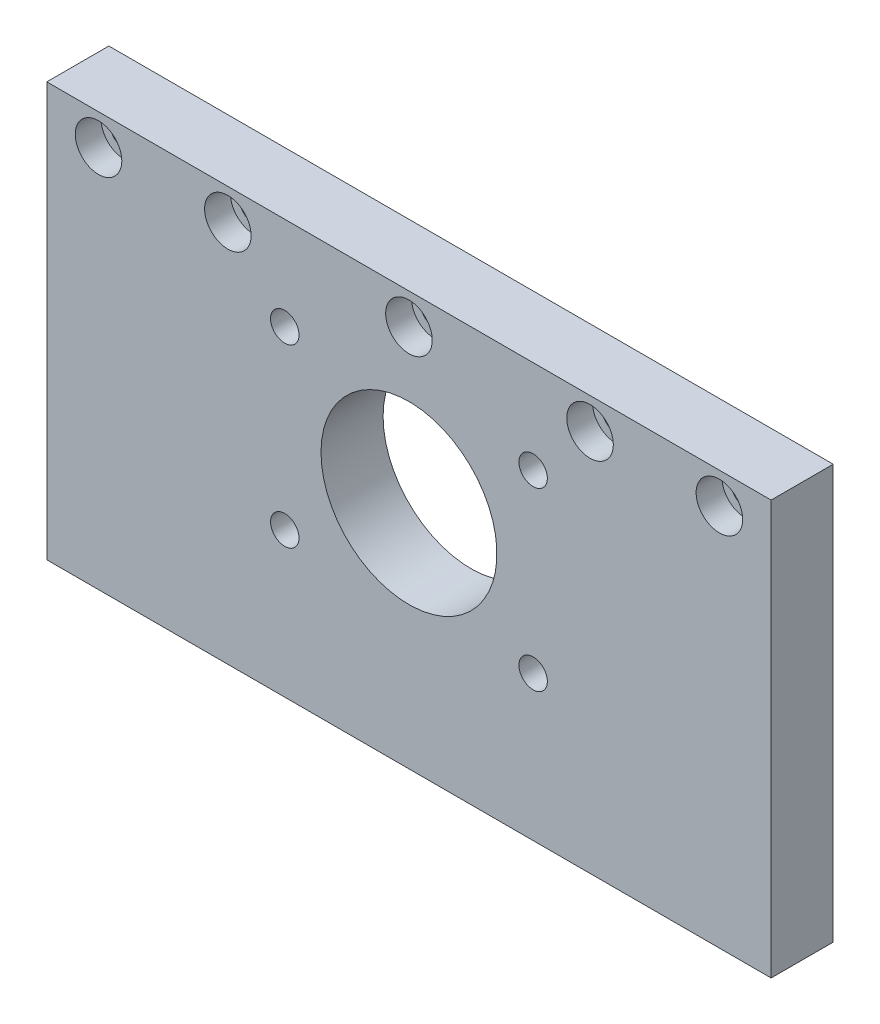
ISO-10303-21;
HEADER;
FILE_DESCRIPTION(('STEP AP214'),'2;1');
FILE_NAME('part.step','',(''),(''),'','','');
FILE_SCHEMA(('AUTOMOTIVE_DESIGN { 1 0 10303 214 1 1 1 1 }'));
ENDSEC;
DATA;
#1=APPLICATION_CONTEXT('core data for automotive mechanical design processes');
#2=APPLICATION_PROTOCOL_DEFINITION('international standard','automotive_design',2000,#1);
#3=PRODUCT_CONTEXT('',#1,'mechanical');
#4=PRODUCT('Part','Part','',(#3));
#5=PRODUCT_RELATED_PRODUCT_CATEGORY('part','',(#4));
#6=PRODUCT_DEFINITION_FORMATION('','',#4);
#7=PRODUCT_DEFINITION_CONTEXT('part definition',#1,'design');
#8=PRODUCT_DEFINITION('design','',#6,#7);
#9=PRODUCT_DEFINITION_SHAPE('','',#8);
#10=(LENGTH_UNIT() NAMED_UNIT(*) SI_UNIT(.MILLI.,.METRE.));
#11=(NAMED_UNIT(*) PLANE_ANGLE_UNIT() SI_UNIT($,.RADIAN.));
#12=(NAMED_UNIT(*) SI_UNIT($,.STERADIAN.) SOLID_ANGLE_UNIT());
#13=UNCERTAINTY_MEASURE_WITH_UNIT(LENGTH_MEASURE(1.E-05),#10,'distance_accuracy_value','');
#14=(GEOMETRIC_REPRESENTATION_CONTEXT(3) GLOBAL_UNCERTAINTY_ASSIGNED_CONTEXT((#13)) GLOBAL_UNIT_ASSIGNED_CONTEXT((#10,
#11,#12)) REPRESENTATION_CONTEXT('',''));
#15=CARTESIAN_POINT('',(0.,0.,0.));
#16=DIRECTION('',(0.,0.,1.));
#17=DIRECTION('',(1.,0.,0.));
#18=AXIS2_PLACEMENT_3D('',#15,#16,#17);
#19=CARTESIAN_POINT('',(0.,13.,12.));
#20=DIRECTION('',(-1.,0.,0.));
#21=DIRECTION('',(0.,-1.,0.));
#22=AXIS2_PLACEMENT_3D('',#19,#20,#21);
#23=PLANE('',#22);
#24=DIRECTION('',(0.,1.,0.));
#25=VECTOR('',#24,1.);
#26=CARTESIAN_POINT('',(0.,13.,0.));
#27=LINE('',#26,#25);
#28=CARTESIAN_POINT('',(0.,-67.,0.));
#29=VERTEX_POINT('',#28);
#30=CARTESIAN_POINT('',(0.,13.,0.));
#31=VERTEX_POINT('',#30);
#32=EDGE_CURVE('E95',#29,#31,#27,.T.);
#33=ORIENTED_EDGE('',*,*,#32,.T.);
#34=DIRECTION('',(0.,0.,-1.));
#35=VECTOR('',#34,1.);
#36=CARTESIAN_POINT('',(0.,13.,12.));
#37=LINE('',#36,#35);
#38=CARTESIAN_POINT('',(0.,13.,12.));
#39=VERTEX_POINT('',#38);
#40=EDGE_CURVE('E11',#39,#31,#37,.T.);
#41=ORIENTED_EDGE('',*,*,#40,.F.);
#42=DIRECTION('',(0.,1.,0.));
#43=VECTOR('',#42,1.);
#44=CARTESIAN_POINT('',(0.,13.,12.));
#45=LINE('',#44,#43);
#46=CARTESIAN_POINT('',(0.,-67.,12.));
#47=VERTEX_POINT('',#46);
#48=EDGE_CURVE('E83',#47,#39,#45,.T.);
#49=ORIENTED_EDGE('',*,*,#48,.F.);
#50=DIRECTION('',(0.,0.,-1.));
#51=VECTOR('',#50,1.);
#52=CARTESIAN_POINT('',(0.,-67.,12.));
#53=LINE('',#52,#51);
#54=EDGE_CURVE('E91',#47,#29,#53,.T.);
#55=ORIENTED_EDGE('',*,*,#54,.T.);
#56=EDGE_LOOP('',(#33,#41,#49,#55));
#57=FACE_BOUND('',#56,.T.);
#58=ADVANCED_FACE('F32',(#57),#23,.F.);
#59=CARTESIAN_POINT('',(0.,13.,12.));
#60=DIRECTION('',(0.,-1.,0.));
#61=DIRECTION('',(1.,0.,0.));
#62=AXIS2_PLACEMENT_3D('',#59,#60,#61);
#63=PLANE('',#62);
#64=DIRECTION('',(-1.,0.,0.));
#65=VECTOR('',#64,1.);
#66=CARTESIAN_POINT('',(0.,13.,0.));
#67=LINE('',#66,#65);
#68=CARTESIAN_POINT('',(-140.,13.,0.));
#69=VERTEX_POINT('',#68);
#70=EDGE_CURVE('E87',#31,#69,#67,.T.);
#71=ORIENTED_EDGE('',*,*,#70,.T.);
#72=DIRECTION('',(0.,0.,-1.));
#73=VECTOR('',#72,1.);
#74=CARTESIAN_POINT('',(-140.,13.,12.));
#75=LINE('',#74,#73);
#76=CARTESIAN_POINT('',(-140.,13.,12.));
#77=VERTEX_POINT('',#76);
#78=EDGE_CURVE('E40',#77,#69,#75,.T.);
#79=ORIENTED_EDGE('',*,*,#78,.F.);
#80=DIRECTION('',(-1.,0.,0.));
#81=VECTOR('',#80,1.);
#82=CARTESIAN_POINT('',(0.,13.,12.));
#83=LINE('',#82,#81);
#84=EDGE_CURVE('E78',#39,#77,#83,.T.);
#85=ORIENTED_EDGE('',*,*,#84,.F.);
#86=ORIENTED_EDGE('',*,*,#40,.T.);
#87=EDGE_LOOP('',(#71,#79,#85,#86));
#88=FACE_BOUND('',#87,.T.);
#89=ADVANCED_FACE('F86',(#88),#63,.F.);
#90=CARTESIAN_POINT('',(-140.,13.,12.));
#91=DIRECTION('',(1.,0.,0.));
#92=DIRECTION('',(0.,1.,0.));
#93=AXIS2_PLACEMENT_3D('',#90,#91,#92);
#94=PLANE('',#93);
#95=DIRECTION('',(0.,-1.,0.));
#96=VECTOR('',#95,1.);
#97=CARTESIAN_POINT('',(-140.,13.,0.));
#98=LINE('',#97,#96);
#99=CARTESIAN_POINT('',(-140.,-67.,0.));
#100=VERTEX_POINT('',#99);
#101=EDGE_CURVE('E65',#69,#100,#98,.T.);
#102=ORIENTED_EDGE('',*,*,#101,.T.);
#103=DIRECTION('',(0.,0.,-1.));
#104=VECTOR('',#103,1.);
#105=CARTESIAN_POINT('',(-140.,-67.,12.));
#106=LINE('',#105,#104);
#107=CARTESIAN_POINT('',(-140.,-67.,12.));
#108=VERTEX_POINT('',#107);
#109=EDGE_CURVE('E88',#108,#100,#106,.T.);
#110=ORIENTED_EDGE('',*,*,#109,.F.);
#111=DIRECTION('',(0.,-1.,0.));
#112=VECTOR('',#111,1.);
#113=CARTESIAN_POINT('',(-140.,13.,12.));
#114=LINE('',#113,#112);
#115=EDGE_CURVE('E81',#77,#108,#114,.T.);
#116=ORIENTED_EDGE('',*,*,#115,.F.);
#117=ORIENTED_EDGE('',*,*,#78,.T.);
#118=EDGE_LOOP('',(#102,#110,#116,#117));
#119=FACE_BOUND('',#118,.T.);
#120=ADVANCED_FACE('F89',(#119),#94,.F.);
#121=CARTESIAN_POINT('',(0.,-67.,12.));
#122=DIRECTION('',(0.,1.,0.));
#123=DIRECTION('',(-1.,0.,0.));
#124=AXIS2_PLACEMENT_3D('',#121,#122,#123);
#125=PLANE('',#124);
#126=DIRECTION('',(1.,0.,0.));
#127=VECTOR('',#126,1.);
#128=CARTESIAN_POINT('',(0.,-67.,0.));
#129=LINE('',#128,#127);
#130=EDGE_CURVE('E71',#100,#29,#129,.T.);
#131=ORIENTED_EDGE('',*,*,#130,.T.);
#132=ORIENTED_EDGE('',*,*,#54,.F.);
#133=DIRECTION('',(1.,0.,0.));
#134=VECTOR('',#133,1.);
#135=CARTESIAN_POINT('',(0.,-67.,12.));
#136=LINE('',#135,#134);
#137=EDGE_CURVE('E48',#108,#47,#136,.T.);
#138=ORIENTED_EDGE('',*,*,#137,.F.);
#139=ORIENTED_EDGE('',*,*,#109,.T.);
#140=EDGE_LOOP('',(#131,#132,#138,#139));
#141=FACE_BOUND('',#140,.T.);
#142=ADVANCED_FACE('F103',(#141),#125,.F.);
#143=CARTESIAN_POINT('',(0.,0.,12.));
#144=DIRECTION('',(0.,0.,-1.));
#145=DIRECTION('',(-1.,0.,0.));
#146=AXIS2_PLACEMENT_3D('',#143,#144,#145);
#147=PLANE('',#146);
#148=CARTESIAN_POINT('',(-94.,-39.,12.));
#149=DIRECTION('',(0.,0.,-1.));
#150=DIRECTION('',(-1.,0.,0.));
#151=AXIS2_PLACEMENT_3D('',#148,#149,#150);
#152=CIRCLE('',#151,2.75);
#153=CARTESIAN_POINT('',(-96.75,-39.,12.));
#154=VERTEX_POINT('',#153);
#155=EDGE_CURVE('E210',#154,#154,#152,.T.);
#156=ORIENTED_EDGE('',*,*,#155,.T.);
#157=EDGE_LOOP('',(#156));
#158=FACE_BOUND('',#157,.T.);
#159=CARTESIAN_POINT('',(-94.,-5.00000000000001,12.));
#160=DIRECTION('',(0.,0.,-1.));
#161=DIRECTION('',(-1.,0.,0.));
#162=AXIS2_PLACEMENT_3D('',#159,#160,#161);
#163=CIRCLE('',#162,2.75);
#164=CARTESIAN_POINT('',(-96.75,-5.00000000000001,12.));
#165=VERTEX_POINT('',#164);
#166=EDGE_CURVE('E198',#165,#165,#163,.T.);
#167=ORIENTED_EDGE('',*,*,#166,.T.);
#168=EDGE_LOOP('',(#167));
#169=FACE_BOUND('',#168,.T.);
#170=CARTESIAN_POINT('',(-46.,-39.,12.));
#171=DIRECTION('',(0.,0.,-1.));
#172=DIRECTION('',(-1.,0.,0.));
#173=AXIS2_PLACEMENT_3D('',#170,#171,#172);
#174=CIRCLE('',#173,2.75);
#175=CARTESIAN_POINT('',(-48.75,-39.,12.));
#176=VERTEX_POINT('',#175);
#177=EDGE_CURVE('E186',#176,#176,#174,.T.);
#178=ORIENTED_EDGE('',*,*,#177,.T.);
#179=EDGE_LOOP('',(#178));
#180=FACE_BOUND('',#179,.T.);
#181=CARTESIAN_POINT('',(-46.,-5.00000000000001,12.));
#182=DIRECTION('',(0.,0.,-1.));
#183=DIRECTION('',(-1.,0.,0.));
#184=AXIS2_PLACEMENT_3D('',#181,#182,#183);
#185=CIRCLE('',#184,2.75);
#186=CARTESIAN_POINT('',(-48.75,-5.00000000000001,12.));
#187=VERTEX_POINT('',#186);
#188=EDGE_CURVE('E172',#187,#187,#185,.T.);
#189=ORIENTED_EDGE('',*,*,#188,.T.);
#190=EDGE_LOOP('',(#189));
#191=FACE_BOUND('',#190,.T.);
#192=CARTESIAN_POINT('',(-70.0000000000001,-22.4999999999999,12.));
#193=DIRECTION('',(0.,0.,-1.));
#194=DIRECTION('',(-1.,0.,0.));
#195=AXIS2_PLACEMENT_3D('',#192,#193,#194);
#196=CIRCLE('',#195,17.);
#197=CARTESIAN_POINT('',(-87.,-22.4999999999999,12.));
#198=VERTEX_POINT('',#197);
#199=EDGE_CURVE('E168',#198,#198,#196,.T.);
#200=ORIENTED_EDGE('',*,*,#199,.T.);
#201=EDGE_LOOP('',(#200));
#202=FACE_BOUND('',#201,.T.);
#203=CARTESIAN_POINT('',(-9.99999999999999,6.99999999999999,12.));
#204=DIRECTION('',(0.,0.,1.));
#205=DIRECTION('',(1.,0.,0.));
#206=AXIS2_PLACEMENT_3D('',#203,#204,#205);
#207=CIRCLE('',#206,4.5);
#208=CARTESIAN_POINT('',(-5.49999999999999,6.99999999999999,12.));
#209=VERTEX_POINT('',#208);
#210=EDGE_CURVE('E165',#209,#209,#207,.T.);
#211=ORIENTED_EDGE('',*,*,#210,.F.);
#212=EDGE_LOOP('',(#211));
#213=FACE_BOUND('',#212,.T.);
#214=CARTESIAN_POINT('',(-35.,6.99999999999999,12.));
#215=DIRECTION('',(0.,0.,1.));
#216=DIRECTION('',(1.,0.,0.));
#217=AXIS2_PLACEMENT_3D('',#214,#215,#216);
#218=CIRCLE('',#217,4.5);
#219=CARTESIAN_POINT('',(-30.5,6.99999999999999,12.));
#220=VERTEX_POINT('',#219);
#221=EDGE_CURVE('E153',#220,#220,#218,.T.);
#222=ORIENTED_EDGE('',*,*,#221,.F.);
#223=EDGE_LOOP('',(#222));
#224=FACE_BOUND('',#223,.T.);
#225=CARTESIAN_POINT('',(-105.,6.99999999999999,12.));
#226=DIRECTION('',(0.,0.,1.));
#227=DIRECTION('',(1.,0.,0.));
#228=AXIS2_PLACEMENT_3D('',#225,#226,#227);
#229=CIRCLE('',#228,4.5);
#230=CARTESIAN_POINT('',(-100.5,6.99999999999999,12.));
#231=VERTEX_POINT('',#230);
#232=EDGE_CURVE('E141',#231,#231,#229,.T.);
#233=ORIENTED_EDGE('',*,*,#232,.F.);
#234=EDGE_LOOP('',(#233));
#235=FACE_BOUND('',#234,.T.);
#236=CARTESIAN_POINT('',(-130.,6.99999999999998,12.));
#237=DIRECTION('',(0.,0.,1.));
#238=DIRECTION('',(1.,0.,0.));
#239=AXIS2_PLACEMENT_3D('',#236,#237,#238);
#240=CIRCLE('',#239,4.5);
#241=CARTESIAN_POINT('',(-125.5,6.99999999999998,12.));
#242=VERTEX_POINT('',#241);
#243=EDGE_CURVE('E129',#242,#242,#240,.T.);
#244=ORIENTED_EDGE('',*,*,#243,.F.);
#245=EDGE_LOOP('',(#244));
#246=FACE_BOUND('',#245,.T.);
#247=CARTESIAN_POINT('',(-70.,6.99999999999999,12.));
#248=DIRECTION('',(0.,0.,1.));
#249=DIRECTION('',(1.,0.,0.));
#250=AXIS2_PLACEMENT_3D('',#247,#248,#249);
#251=CIRCLE('',#250,4.5);
#252=CARTESIAN_POINT('',(-65.5,6.99999999999999,12.));
#253=VERTEX_POINT('',#252);
#254=EDGE_CURVE('E117',#253,#253,#251,.T.);
#255=ORIENTED_EDGE('',*,*,#254,.F.);
#256=EDGE_LOOP('',(#255));
#257=FACE_BOUND('',#256,.T.);
#258=ORIENTED_EDGE('',*,*,#48,.T.);
#259=ORIENTED_EDGE('',*,*,#84,.T.);
#260=ORIENTED_EDGE('',*,*,#115,.T.);
#261=ORIENTED_EDGE('',*,*,#137,.T.);
#262=EDGE_LOOP('',(#258,#259,#260,#261));
#263=FACE_BOUND('',#262,.T.);
#264=ADVANCED_FACE('F79',(#158,#169,#180,#191,#202,#213,#224,#235,#246,#257,#263),#147,.F.);
#265=CARTESIAN_POINT('',(0.,0.,0.));
#266=DIRECTION('',(0.,0.,-1.));
#267=DIRECTION('',(-1.,0.,0.));
#268=AXIS2_PLACEMENT_3D('',#265,#266,#267);
#269=PLANE('',#268);
#270=CARTESIAN_POINT('',(-94.,-39.,0.));
#271=DIRECTION('',(0.,0.,-1.));
#272=DIRECTION('',(-1.,0.,0.));
#273=AXIS2_PLACEMENT_3D('',#270,#271,#272);
#274=CIRCLE('',#273,4.49999999999999);
#275=CARTESIAN_POINT('',(-98.5,-39.,0.));
#276=VERTEX_POINT('',#275);
#277=EDGE_CURVE('E219',#276,#276,#274,.T.);
#278=ORIENTED_EDGE('',*,*,#277,.F.);
#279=EDGE_LOOP('',(#278));
#280=FACE_BOUND('',#279,.T.);
#281=CARTESIAN_POINT('',(-94.,-5.00000000000001,0.));
#282=DIRECTION('',(0.,0.,-1.));
#283=DIRECTION('',(-1.,0.,0.));
#284=AXIS2_PLACEMENT_3D('',#281,#282,#283);
#285=CIRCLE('',#284,4.49999999999999);
#286=CARTESIAN_POINT('',(-98.5,-5.00000000000001,0.));
#287=VERTEX_POINT('',#286);
#288=EDGE_CURVE('E207',#287,#287,#285,.T.);
#289=ORIENTED_EDGE('',*,*,#288,.F.);
#290=EDGE_LOOP('',(#289));
#291=FACE_BOUND('',#290,.T.);
#292=CARTESIAN_POINT('',(-46.,-39.,0.));
#293=DIRECTION('',(0.,0.,-1.));
#294=DIRECTION('',(-1.,0.,0.));
#295=AXIS2_PLACEMENT_3D('',#292,#293,#294);
#296=CIRCLE('',#295,4.49999999999999);
#297=CARTESIAN_POINT('',(-50.5,-39.,0.));
#298=VERTEX_POINT('',#297);
#299=EDGE_CURVE('E195',#298,#298,#296,.T.);
#300=ORIENTED_EDGE('',*,*,#299,.F.);
#301=EDGE_LOOP('',(#300));
#302=FACE_BOUND('',#301,.T.);
#303=CARTESIAN_POINT('',(-46.,-5.00000000000001,0.));
#304=DIRECTION('',(0.,0.,-1.));
#305=DIRECTION('',(-1.,0.,0.));
#306=AXIS2_PLACEMENT_3D('',#303,#304,#305);
#307=CIRCLE('',#306,4.49999999999999);
#308=CARTESIAN_POINT('',(-50.5,-5.00000000000001,0.));
#309=VERTEX_POINT('',#308);
#310=EDGE_CURVE('E183',#309,#309,#307,.T.);
#311=ORIENTED_EDGE('',*,*,#310,.F.);
#312=EDGE_LOOP('',(#311));
#313=FACE_BOUND('',#312,.T.);
#314=CARTESIAN_POINT('',(-70.0000000000001,-22.4999999999999,0.));
#315=DIRECTION('',(0.,0.,-1.));
#316=DIRECTION('',(-1.,0.,0.));
#317=AXIS2_PLACEMENT_3D('',#314,#315,#316);
#318=CIRCLE('',#317,17.);
#319=CARTESIAN_POINT('',(-87.,-22.4999999999999,0.));
#320=VERTEX_POINT('',#319);
#321=EDGE_CURVE('E169',#320,#320,#318,.T.);
#322=ORIENTED_EDGE('',*,*,#321,.F.);
#323=EDGE_LOOP('',(#322));
#324=FACE_BOUND('',#323,.T.);
#325=CARTESIAN_POINT('',(-9.99999999999999,6.99999999999999,0.));
#326=DIRECTION('',(0.,0.,1.));
#327=DIRECTION('',(1.,0.,0.));
#328=AXIS2_PLACEMENT_3D('',#325,#326,#327);
#329=CIRCLE('',#328,2.75);
#330=CARTESIAN_POINT('',(-7.24999999999999,6.99999999999999,0.));
#331=VERTEX_POINT('',#330);
#332=EDGE_CURVE('E156',#331,#331,#329,.T.);
#333=ORIENTED_EDGE('',*,*,#332,.T.);
#334=EDGE_LOOP('',(#333));
#335=FACE_BOUND('',#334,.T.);
#336=CARTESIAN_POINT('',(-35.,6.99999999999999,0.));
#337=DIRECTION('',(0.,0.,1.));
#338=DIRECTION('',(1.,0.,0.));
#339=AXIS2_PLACEMENT_3D('',#336,#337,#338);
#340=CIRCLE('',#339,2.75);
#341=CARTESIAN_POINT('',(-32.25,6.99999999999999,0.));
#342=VERTEX_POINT('',#341);
#343=EDGE_CURVE('E144',#342,#342,#340,.T.);
#344=ORIENTED_EDGE('',*,*,#343,.T.);
#345=EDGE_LOOP('',(#344));
#346=FACE_BOUND('',#345,.T.);
#347=CARTESIAN_POINT('',(-105.,6.99999999999999,0.));
#348=DIRECTION('',(0.,0.,1.));
#349=DIRECTION('',(1.,0.,0.));
#350=AXIS2_PLACEMENT_3D('',#347,#348,#349);
#351=CIRCLE('',#350,2.75);
#352=CARTESIAN_POINT('',(-102.25,6.99999999999999,0.));
#353=VERTEX_POINT('',#352);
#354=EDGE_CURVE('E132',#353,#353,#351,.T.);
#355=ORIENTED_EDGE('',*,*,#354,.T.);
#356=EDGE_LOOP('',(#355));
#357=FACE_BOUND('',#356,.T.);
#358=CARTESIAN_POINT('',(-130.,6.99999999999998,0.));
#359=DIRECTION('',(0.,0.,1.));
#360=DIRECTION('',(1.,0.,0.));
#361=AXIS2_PLACEMENT_3D('',#358,#359,#360);
#362=CIRCLE('',#361,2.75);
#363=CARTESIAN_POINT('',(-127.25,6.99999999999998,0.));
#364=VERTEX_POINT('',#363);
#365=EDGE_CURVE('E120',#364,#364,#362,.T.);
#366=ORIENTED_EDGE('',*,*,#365,.T.);
#367=EDGE_LOOP('',(#366));
#368=FACE_BOUND('',#367,.T.);
#369=CARTESIAN_POINT('',(-70.,6.99999999999999,0.));
#370=DIRECTION('',(0.,0.,1.));
#371=DIRECTION('',(1.,0.,0.));
#372=AXIS2_PLACEMENT_3D('',#369,#370,#371);
#373=CIRCLE('',#372,2.75);
#374=CARTESIAN_POINT('',(-67.25,6.99999999999999,0.));
#375=VERTEX_POINT('',#374);
#376=EDGE_CURVE('E98',#375,#375,#373,.T.);
#377=ORIENTED_EDGE('',*,*,#376,.T.);
#378=EDGE_LOOP('',(#377));
#379=FACE_BOUND('',#378,.T.);
#380=ORIENTED_EDGE('',*,*,#32,.F.);
#381=ORIENTED_EDGE('',*,*,#130,.F.);
#382=ORIENTED_EDGE('',*,*,#101,.F.);
#383=ORIENTED_EDGE('',*,*,#70,.F.);
#384=EDGE_LOOP('',(#380,#381,#382,#383));
#385=FACE_BOUND('',#384,.T.);
#386=ADVANCED_FACE('F106',(#280,#291,#302,#313,#324,#335,#346,#357,#368,#379,#385),#269,.T.);
#387=CARTESIAN_POINT('',(-70.,6.99999999999999,12.));
#388=DIRECTION('',(0.,0.,1.));
#389=DIRECTION('',(1.,0.,0.));
#390=AXIS2_PLACEMENT_3D('',#387,#388,#389);
#391=CYLINDRICAL_SURFACE('',#390,2.75);
#392=ORIENTED_EDGE('',*,*,#376,.F.);
#393=EDGE_LOOP('',(#392));
#394=FACE_BOUND('',#393,.T.);
#395=CARTESIAN_POINT('',(-70.,6.99999999999999,7.));
#396=DIRECTION('',(0.,0.,1.));
#397=DIRECTION('',(1.,0.,0.));
#398=AXIS2_PLACEMENT_3D('',#395,#396,#397);
#399=CIRCLE('',#398,2.75);
#400=CARTESIAN_POINT('',(-67.25,6.99999999999999,7.));
#401=VERTEX_POINT('',#400);
#402=EDGE_CURVE('E111',#401,#401,#399,.T.);
#403=ORIENTED_EDGE('',*,*,#402,.T.);
#404=EDGE_LOOP('',(#403));
#405=FACE_BOUND('',#404,.T.);
#406=ADVANCED_FACE('F227',(#394,#405),#391,.F.);
#407=CARTESIAN_POINT('',(-67.25,6.99999999999999,7.));
#408=DIRECTION('',(0.,0.,-1.));
#409=DIRECTION('',(-1.,0.,0.));
#410=AXIS2_PLACEMENT_3D('',#407,#408,#409);
#411=PLANE('',#410);
#412=ORIENTED_EDGE('',*,*,#402,.F.);
#413=EDGE_LOOP('',(#412));
#414=FACE_BOUND('',#413,.T.);
#415=CARTESIAN_POINT('',(-70.,6.99999999999999,7.));
#416=DIRECTION('',(0.,0.,1.));
#417=DIRECTION('',(1.,0.,0.));
#418=AXIS2_PLACEMENT_3D('',#415,#416,#417);
#419=CIRCLE('',#418,4.5);
#420=CARTESIAN_POINT('',(-65.5,6.99999999999999,7.));
#421=VERTEX_POINT('',#420);
#422=EDGE_CURVE('E114',#421,#421,#419,.T.);
#423=ORIENTED_EDGE('',*,*,#422,.T.);
#424=EDGE_LOOP('',(#423));
#425=FACE_BOUND('',#424,.T.);
#426=ADVANCED_FACE('F249',(#414,#425),#411,.F.);
#427=CARTESIAN_POINT('',(-70.,6.99999999999999,12.));
#428=DIRECTION('',(0.,0.,1.));
#429=DIRECTION('',(1.,0.,0.));
#430=AXIS2_PLACEMENT_3D('',#427,#428,#429);
#431=CYLINDRICAL_SURFACE('',#430,4.5);
#432=ORIENTED_EDGE('',*,*,#422,.F.);
#433=EDGE_LOOP('',(#432));
#434=FACE_BOUND('',#433,.T.);
#435=ORIENTED_EDGE('',*,*,#254,.T.);
#436=EDGE_LOOP('',(#435));
#437=FACE_BOUND('',#436,.T.);
#438=ADVANCED_FACE('F255',(#434,#437),#431,.F.);
#439=CARTESIAN_POINT('',(-130.,6.99999999999998,12.));
#440=DIRECTION('',(0.,0.,1.));
#441=DIRECTION('',(1.,0.,0.));
#442=AXIS2_PLACEMENT_3D('',#439,#440,#441);
#443=CYLINDRICAL_SURFACE('',#442,2.75);
#444=ORIENTED_EDGE('',*,*,#365,.F.);
#445=EDGE_LOOP('',(#444));
#446=FACE_BOUND('',#445,.T.);
#447=CARTESIAN_POINT('',(-130.,6.99999999999998,7.));
#448=DIRECTION('',(0.,0.,1.));
#449=DIRECTION('',(1.,0.,0.));
#450=AXIS2_PLACEMENT_3D('',#447,#448,#449);
#451=CIRCLE('',#450,2.75);
#452=CARTESIAN_POINT('',(-127.25,6.99999999999998,7.));
#453=VERTEX_POINT('',#452);
#454=EDGE_CURVE('E123',#453,#453,#451,.T.);
#455=ORIENTED_EDGE('',*,*,#454,.T.);
#456=EDGE_LOOP('',(#455));
#457=FACE_BOUND('',#456,.T.);
#458=ADVANCED_FACE('F261',(#446,#457),#443,.F.);
#459=CARTESIAN_POINT('',(-127.25,6.99999999999998,7.));
#460=DIRECTION('',(0.,0.,-1.));
#461=DIRECTION('',(-1.,0.,0.));
#462=AXIS2_PLACEMENT_3D('',#459,#460,#461);
#463=PLANE('',#462);
#464=ORIENTED_EDGE('',*,*,#454,.F.);
#465=EDGE_LOOP('',(#464));
#466=FACE_BOUND('',#465,.T.);
#467=CARTESIAN_POINT('',(-130.,6.99999999999998,7.));
#468=DIRECTION('',(0.,0.,1.));
#469=DIRECTION('',(1.,0.,0.));
#470=AXIS2_PLACEMENT_3D('',#467,#468,#469);
#471=CIRCLE('',#470,4.5);
#472=CARTESIAN_POINT('',(-125.5,6.99999999999998,7.));
#473=VERTEX_POINT('',#472);
#474=EDGE_CURVE('E126',#473,#473,#471,.T.);
#475=ORIENTED_EDGE('',*,*,#474,.T.);
#476=EDGE_LOOP('',(#475));
#477=FACE_BOUND('',#476,.T.);
#478=ADVANCED_FACE('F316',(#466,#477),#463,.F.);
#479=CARTESIAN_POINT('',(-130.,6.99999999999998,12.));
#480=DIRECTION('',(0.,0.,1.));
#481=DIRECTION('',(1.,0.,0.));
#482=AXIS2_PLACEMENT_3D('',#479,#480,#481);
#483=CYLINDRICAL_SURFACE('',#482,4.5);
#484=ORIENTED_EDGE('',*,*,#474,.F.);
#485=EDGE_LOOP('',(#484));
#486=FACE_BOUND('',#485,.T.);
#487=ORIENTED_EDGE('',*,*,#243,.T.);
#488=EDGE_LOOP('',(#487));
#489=FACE_BOUND('',#488,.T.);
#490=ADVANCED_FACE('F326',(#486,#489),#483,.F.);
#491=CARTESIAN_POINT('',(-105.,6.99999999999999,12.));
#492=DIRECTION('',(0.,0.,1.));
#493=DIRECTION('',(1.,0.,0.));
#494=AXIS2_PLACEMENT_3D('',#491,#492,#493);
#495=CYLINDRICAL_SURFACE('',#494,2.75);
#496=ORIENTED_EDGE('',*,*,#354,.F.);
#497=EDGE_LOOP('',(#496));
#498=FACE_BOUND('',#497,.T.);
#499=CARTESIAN_POINT('',(-105.,6.99999999999999,7.));
#500=DIRECTION('',(0.,0.,1.));
#501=DIRECTION('',(1.,0.,0.));
#502=AXIS2_PLACEMENT_3D('',#499,#500,#501);
#503=CIRCLE('',#502,2.75);
#504=CARTESIAN_POINT('',(-102.25,6.99999999999999,7.));
#505=VERTEX_POINT('',#504);
#506=EDGE_CURVE('E135',#505,#505,#503,.T.);
#507=ORIENTED_EDGE('',*,*,#506,.T.);
#508=EDGE_LOOP('',(#507));
#509=FACE_BOUND('',#508,.T.);
#510=ADVANCED_FACE('F336',(#498,#509),#495,.F.);
#511=CARTESIAN_POINT('',(-102.25,6.99999999999999,7.));
#512=DIRECTION('',(0.,0.,-1.));
#513=DIRECTION('',(-1.,0.,0.));
#514=AXIS2_PLACEMENT_3D('',#511,#512,#513);
#515=PLANE('',#514);
#516=ORIENTED_EDGE('',*,*,#506,.F.);
#517=EDGE_LOOP('',(#516));
#518=FACE_BOUND('',#517,.T.);
#519=CARTESIAN_POINT('',(-105.,6.99999999999999,7.));
#520=DIRECTION('',(0.,0.,1.));
#521=DIRECTION('',(1.,0.,0.));
#522=AXIS2_PLACEMENT_3D('',#519,#520,#521);
#523=CIRCLE('',#522,4.5);
#524=CARTESIAN_POINT('',(-100.5,6.99999999999999,7.));
#525=VERTEX_POINT('',#524);
#526=EDGE_CURVE('E138',#525,#525,#523,.T.);
#527=ORIENTED_EDGE('',*,*,#526,.T.);
#528=EDGE_LOOP('',(#527));
#529=FACE_BOUND('',#528,.T.);
#530=ADVANCED_FACE('F346',(#518,#529),#515,.F.);
#531=CARTESIAN_POINT('',(-105.,6.99999999999999,12.));
#532=DIRECTION('',(0.,0.,1.));
#533=DIRECTION('',(1.,0.,0.));
#534=AXIS2_PLACEMENT_3D('',#531,#532,#533);
#535=CYLINDRICAL_SURFACE('',#534,4.5);
#536=ORIENTED_EDGE('',*,*,#526,.F.);
#537=EDGE_LOOP('',(#536));
#538=FACE_BOUND('',#537,.T.);
#539=ORIENTED_EDGE('',*,*,#232,.T.);
#540=EDGE_LOOP('',(#539));
#541=FACE_BOUND('',#540,.T.);
#542=ADVANCED_FACE('F356',(#538,#541),#535,.F.);
#543=CARTESIAN_POINT('',(-35.,6.99999999999999,12.));
#544=DIRECTION('',(0.,0.,1.));
#545=DIRECTION('',(1.,0.,0.));
#546=AXIS2_PLACEMENT_3D('',#543,#544,#545);
#547=CYLINDRICAL_SURFACE('',#546,2.75);
#548=ORIENTED_EDGE('',*,*,#343,.F.);
#549=EDGE_LOOP('',(#548));
#550=FACE_BOUND('',#549,.T.);
#551=CARTESIAN_POINT('',(-35.,6.99999999999999,7.));
#552=DIRECTION('',(0.,0.,1.));
#553=DIRECTION('',(1.,0.,0.));
#554=AXIS2_PLACEMENT_3D('',#551,#552,#553);
#555=CIRCLE('',#554,2.75);
#556=CARTESIAN_POINT('',(-32.25,6.99999999999999,7.));
#557=VERTEX_POINT('',#556);
#558=EDGE_CURVE('E147',#557,#557,#555,.T.);
#559=ORIENTED_EDGE('',*,*,#558,.T.);
#560=EDGE_LOOP('',(#559));
#561=FACE_BOUND('',#560,.T.);
#562=ADVANCED_FACE('F366',(#550,#561),#547,.F.);
#563=CARTESIAN_POINT('',(-32.25,6.99999999999999,7.));
#564=DIRECTION('',(0.,0.,-1.));
#565=DIRECTION('',(-1.,0.,0.));
#566=AXIS2_PLACEMENT_3D('',#563,#564,#565);
#567=PLANE('',#566);
#568=ORIENTED_EDGE('',*,*,#558,.F.);
#569=EDGE_LOOP('',(#568));
#570=FACE_BOUND('',#569,.T.);
#571=CARTESIAN_POINT('',(-35.,6.99999999999999,7.));
#572=DIRECTION('',(0.,0.,1.));
#573=DIRECTION('',(1.,0.,0.));
#574=AXIS2_PLACEMENT_3D('',#571,#572,#573);
#575=CIRCLE('',#574,4.5);
#576=CARTESIAN_POINT('',(-30.5,6.99999999999999,7.));
#577=VERTEX_POINT('',#576);
#578=EDGE_CURVE('E150',#577,#577,#575,.T.);
#579=ORIENTED_EDGE('',*,*,#578,.T.);
#580=EDGE_LOOP('',(#579));
#581=FACE_BOUND('',#580,.T.);
#582=ADVANCED_FACE('F376',(#570,#581),#567,.F.);
#583=CARTESIAN_POINT('',(-35.,6.99999999999999,12.));
#584=DIRECTION('',(0.,0.,1.));
#585=DIRECTION('',(1.,0.,0.));
#586=AXIS2_PLACEMENT_3D('',#583,#584,#585);
#587=CYLINDRICAL_SURFACE('',#586,4.5);
#588=ORIENTED_EDGE('',*,*,#578,.F.);
#589=EDGE_LOOP('',(#588));
#590=FACE_BOUND('',#589,.T.);
#591=ORIENTED_EDGE('',*,*,#221,.T.);
#592=EDGE_LOOP('',(#591));
#593=FACE_BOUND('',#592,.T.);
#594=ADVANCED_FACE('F386',(#590,#593),#587,.F.);
#595=CARTESIAN_POINT('',(-9.99999999999999,6.99999999999999,12.));
#596=DIRECTION('',(0.,0.,1.));
#597=DIRECTION('',(1.,0.,0.));
#598=AXIS2_PLACEMENT_3D('',#595,#596,#597);
#599=CYLINDRICAL_SURFACE('',#598,2.75);
#600=ORIENTED_EDGE('',*,*,#332,.F.);
#601=EDGE_LOOP('',(#600));
#602=FACE_BOUND('',#601,.T.);
#603=CARTESIAN_POINT('',(-9.99999999999999,6.99999999999999,7.));
#604=DIRECTION('',(0.,0.,1.));
#605=DIRECTION('',(1.,0.,0.));
#606=AXIS2_PLACEMENT_3D('',#603,#604,#605);
#607=CIRCLE('',#606,2.75);
#608=CARTESIAN_POINT('',(-7.24999999999999,6.99999999999999,7.));
#609=VERTEX_POINT('',#608);
#610=EDGE_CURVE('E159',#609,#609,#607,.T.);
#611=ORIENTED_EDGE('',*,*,#610,.T.);
#612=EDGE_LOOP('',(#611));
#613=FACE_BOUND('',#612,.T.);
#614=ADVANCED_FACE('F396',(#602,#613),#599,.F.);
#615=CARTESIAN_POINT('',(-7.24999999999999,6.99999999999999,7.));
#616=DIRECTION('',(0.,0.,-1.));
#617=DIRECTION('',(-1.,0.,0.));
#618=AXIS2_PLACEMENT_3D('',#615,#616,#617);
#619=PLANE('',#618);
#620=ORIENTED_EDGE('',*,*,#610,.F.);
#621=EDGE_LOOP('',(#620));
#622=FACE_BOUND('',#621,.T.);
#623=CARTESIAN_POINT('',(-9.99999999999999,6.99999999999999,7.));
#624=DIRECTION('',(0.,0.,1.));
#625=DIRECTION('',(1.,0.,0.));
#626=AXIS2_PLACEMENT_3D('',#623,#624,#625);
#627=CIRCLE('',#626,4.5);
#628=CARTESIAN_POINT('',(-5.49999999999999,6.99999999999999,7.));
#629=VERTEX_POINT('',#628);
#630=EDGE_CURVE('E162',#629,#629,#627,.T.);
#631=ORIENTED_EDGE('',*,*,#630,.T.);
#632=EDGE_LOOP('',(#631));
#633=FACE_BOUND('',#632,.T.);
#634=ADVANCED_FACE('F406',(#622,#633),#619,.F.);
#635=CARTESIAN_POINT('',(-9.99999999999999,6.99999999999999,12.));
#636=DIRECTION('',(0.,0.,1.));
#637=DIRECTION('',(1.,0.,0.));
#638=AXIS2_PLACEMENT_3D('',#635,#636,#637);
#639=CYLINDRICAL_SURFACE('',#638,4.5);
#640=ORIENTED_EDGE('',*,*,#630,.F.);
#641=EDGE_LOOP('',(#640));
#642=FACE_BOUND('',#641,.T.);
#643=ORIENTED_EDGE('',*,*,#210,.T.);
#644=EDGE_LOOP('',(#643));
#645=FACE_BOUND('',#644,.T.);
#646=ADVANCED_FACE('F416',(#642,#645),#639,.F.);
#647=CARTESIAN_POINT('',(-70.0000000000001,-22.4999999999999,12.));
#648=DIRECTION('',(0.,0.,-1.));
#649=DIRECTION('',(-1.,0.,0.));
#650=AXIS2_PLACEMENT_3D('',#647,#648,#649);
#651=CYLINDRICAL_SURFACE('',#650,17.);
#652=ORIENTED_EDGE('',*,*,#199,.F.);
#653=EDGE_LOOP('',(#652));
#654=FACE_BOUND('',#653,.T.);
#655=ORIENTED_EDGE('',*,*,#321,.T.);
#656=EDGE_LOOP('',(#655));
#657=FACE_BOUND('',#656,.T.);
#658=ADVANCED_FACE('F426',(#654,#657),#651,.F.);
#659=CARTESIAN_POINT('',(-46.,-5.00000000000001,0.));
#660=DIRECTION('',(0.,0.,-1.));
#661=DIRECTION('',(-1.,0.,0.));
#662=AXIS2_PLACEMENT_3D('',#659,#660,#661);
#663=CYLINDRICAL_SURFACE('',#662,2.75);
#664=ORIENTED_EDGE('',*,*,#188,.F.);
#665=EDGE_LOOP('',(#664));
#666=FACE_BOUND('',#665,.T.);
#667=CARTESIAN_POINT('',(-46.,-5.00000000000001,6.));
#668=DIRECTION('',(0.,0.,-1.));
#669=DIRECTION('',(-1.,0.,0.));
#670=AXIS2_PLACEMENT_3D('',#667,#668,#669);
#671=CIRCLE('',#670,2.75);
#672=CARTESIAN_POINT('',(-48.75,-5.00000000000001,6.));
#673=VERTEX_POINT('',#672);
#674=EDGE_CURVE('E177',#673,#673,#671,.T.);
#675=ORIENTED_EDGE('',*,*,#674,.T.);
#676=EDGE_LOOP('',(#675));
#677=FACE_BOUND('',#676,.T.);
#678=ADVANCED_FACE('F436',(#666,#677),#663,.F.);
#679=CARTESIAN_POINT('',(-43.25,-5.00000000000001,6.));
#680=DIRECTION('',(0.,0.,1.));
#681=DIRECTION('',(1.,0.,0.));
#682=AXIS2_PLACEMENT_3D('',#679,#680,#681);
#683=PLANE('',#682);
#684=ORIENTED_EDGE('',*,*,#674,.F.);
#685=EDGE_LOOP('',(#684));
#686=FACE_BOUND('',#685,.T.);
#687=CARTESIAN_POINT('',(-46.,-5.00000000000001,6.));
#688=DIRECTION('',(0.,0.,-1.));
#689=DIRECTION('',(-1.,0.,0.));
#690=AXIS2_PLACEMENT_3D('',#687,#688,#689);
#691=CIRCLE('',#690,4.5);
#692=CARTESIAN_POINT('',(-50.5,-5.00000000000001,6.));
#693=VERTEX_POINT('',#692);
#694=EDGE_CURVE('E180',#693,#693,#691,.T.);
#695=ORIENTED_EDGE('',*,*,#694,.T.);
#696=EDGE_LOOP('',(#695));
#697=FACE_BOUND('',#696,.T.);
#698=ADVANCED_FACE('F446',(#686,#697),#683,.F.);
#699=CARTESIAN_POINT('',(-46.,-5.00000000000001,0.));
#700=DIRECTION('',(0.,0.,-1.));
#701=DIRECTION('',(-1.,0.,0.));
#702=AXIS2_PLACEMENT_3D('',#699,#700,#701);
#703=CYLINDRICAL_SURFACE('',#702,4.49999999999999);
#704=ORIENTED_EDGE('',*,*,#694,.F.);
#705=EDGE_LOOP('',(#704));
#706=FACE_BOUND('',#705,.T.);
#707=ORIENTED_EDGE('',*,*,#310,.T.);
#708=EDGE_LOOP('',(#707));
#709=FACE_BOUND('',#708,.T.);
#710=ADVANCED_FACE('F456',(#706,#709),#703,.F.);
#711=CARTESIAN_POINT('',(-46.,-39.,0.));
#712=DIRECTION('',(0.,0.,-1.));
#713=DIRECTION('',(-1.,0.,0.));
#714=AXIS2_PLACEMENT_3D('',#711,#712,#713);
#715=CYLINDRICAL_SURFACE('',#714,2.75);
#716=ORIENTED_EDGE('',*,*,#177,.F.);
#717=EDGE_LOOP('',(#716));
#718=FACE_BOUND('',#717,.T.);
#719=CARTESIAN_POINT('',(-46.,-39.,6.));
#720=DIRECTION('',(0.,0.,-1.));
#721=DIRECTION('',(-1.,0.,0.));
#722=AXIS2_PLACEMENT_3D('',#719,#720,#721);
#723=CIRCLE('',#722,2.75);
#724=CARTESIAN_POINT('',(-48.75,-39.,6.));
#725=VERTEX_POINT('',#724);
#726=EDGE_CURVE('E189',#725,#725,#723,.T.);
#727=ORIENTED_EDGE('',*,*,#726,.T.);
#728=EDGE_LOOP('',(#727));
#729=FACE_BOUND('',#728,.T.);
#730=ADVANCED_FACE('F466',(#718,#729),#715,.F.);
#731=CARTESIAN_POINT('',(-43.25,-39.,6.));
#732=DIRECTION('',(0.,0.,1.));
#733=DIRECTION('',(1.,0.,0.));
#734=AXIS2_PLACEMENT_3D('',#731,#732,#733);
#735=PLANE('',#734);
#736=ORIENTED_EDGE('',*,*,#726,.F.);
#737=EDGE_LOOP('',(#736));
#738=FACE_BOUND('',#737,.T.);
#739=CARTESIAN_POINT('',(-46.,-39.,6.));
#740=DIRECTION('',(0.,0.,-1.));
#741=DIRECTION('',(-1.,0.,0.));
#742=AXIS2_PLACEMENT_3D('',#739,#740,#741);
#743=CIRCLE('',#742,4.5);
#744=CARTESIAN_POINT('',(-50.5,-39.,6.));
#745=VERTEX_POINT('',#744);
#746=EDGE_CURVE('E192',#745,#745,#743,.T.);
#747=ORIENTED_EDGE('',*,*,#746,.T.);
#748=EDGE_LOOP('',(#747));
#749=FACE_BOUND('',#748,.T.);
#750=ADVANCED_FACE('F476',(#738,#749),#735,.F.);
#751=CARTESIAN_POINT('',(-46.,-39.,0.));
#752=DIRECTION('',(0.,0.,-1.));
#753=DIRECTION('',(-1.,0.,0.));
#754=AXIS2_PLACEMENT_3D('',#751,#752,#753);
#755=CYLINDRICAL_SURFACE('',#754,4.49999999999999);
#756=ORIENTED_EDGE('',*,*,#746,.F.);
#757=EDGE_LOOP('',(#756));
#758=FACE_BOUND('',#757,.T.);
#759=ORIENTED_EDGE('',*,*,#299,.T.);
#760=EDGE_LOOP('',(#759));
#761=FACE_BOUND('',#760,.T.);
#762=ADVANCED_FACE('F486',(#758,#761),#755,.F.);
#763=CARTESIAN_POINT('',(-94.,-5.00000000000001,0.));
#764=DIRECTION('',(0.,0.,-1.));
#765=DIRECTION('',(-1.,0.,0.));
#766=AXIS2_PLACEMENT_3D('',#763,#764,#765);
#767=CYLINDRICAL_SURFACE('',#766,2.75);
#768=ORIENTED_EDGE('',*,*,#166,.F.);
#769=EDGE_LOOP('',(#768));
#770=FACE_BOUND('',#769,.T.);
#771=CARTESIAN_POINT('',(-94.,-5.00000000000001,6.));
#772=DIRECTION('',(0.,0.,-1.));
#773=DIRECTION('',(-1.,0.,0.));
#774=AXIS2_PLACEMENT_3D('',#771,#772,#773);
#775=CIRCLE('',#774,2.75);
#776=CARTESIAN_POINT('',(-96.75,-5.00000000000001,6.));
#777=VERTEX_POINT('',#776);
#778=EDGE_CURVE('E201',#777,#777,#775,.T.);
#779=ORIENTED_EDGE('',*,*,#778,.T.);
#780=EDGE_LOOP('',(#779));
#781=FACE_BOUND('',#780,.T.);
#782=ADVANCED_FACE('F495',(#770,#781),#767,.F.);
#783=CARTESIAN_POINT('',(-91.25,-5.00000000000001,6.));
#784=DIRECTION('',(0.,0.,1.));
#785=DIRECTION('',(1.,0.,0.));
#786=AXIS2_PLACEMENT_3D('',#783,#784,#785);
#787=PLANE('',#786);
#788=ORIENTED_EDGE('',*,*,#778,.F.);
#789=EDGE_LOOP('',(#788));
#790=FACE_BOUND('',#789,.T.);
#791=CARTESIAN_POINT('',(-94.,-5.00000000000001,6.));
#792=DIRECTION('',(0.,0.,-1.));
#793=DIRECTION('',(-1.,0.,0.));
#794=AXIS2_PLACEMENT_3D('',#791,#792,#793);
#795=CIRCLE('',#794,4.49999999999999);
#796=CARTESIAN_POINT('',(-98.5,-5.00000000000001,6.));
#797=VERTEX_POINT('',#796);
#798=EDGE_CURVE('E204',#797,#797,#795,.T.);
#799=ORIENTED_EDGE('',*,*,#798,.T.);
#800=EDGE_LOOP('',(#799));
#801=FACE_BOUND('',#800,.T.);
#802=ADVANCED_FACE('F514',(#790,#801),#787,.F.);
#803=CARTESIAN_POINT('',(-94.,-5.00000000000001,0.));
#804=DIRECTION('',(0.,0.,-1.));
#805=DIRECTION('',(-1.,0.,0.));
#806=AXIS2_PLACEMENT_3D('',#803,#804,#805);
#807=CYLINDRICAL_SURFACE('',#806,4.49999999999999);
#808=ORIENTED_EDGE('',*,*,#798,.F.);
#809=EDGE_LOOP('',(#808));
#810=FACE_BOUND('',#809,.T.);
#811=ORIENTED_EDGE('',*,*,#288,.T.);
#812=EDGE_LOOP('',(#811));
#813=FACE_BOUND('',#812,.T.);
#814=ADVANCED_FACE('F524',(#810,#813),#807,.F.);
#815=CARTESIAN_POINT('',(-94.,-39.,0.));
#816=DIRECTION('',(0.,0.,-1.));
#817=DIRECTION('',(-1.,0.,0.));
#818=AXIS2_PLACEMENT_3D('',#815,#816,#817);
#819=CYLINDRICAL_SURFACE('',#818,2.75);
#820=ORIENTED_EDGE('',*,*,#155,.F.);
#821=EDGE_LOOP('',(#820));
#822=FACE_BOUND('',#821,.T.);
#823=CARTESIAN_POINT('',(-94.,-39.,6.));
#824=DIRECTION('',(0.,0.,-1.));
#825=DIRECTION('',(-1.,0.,0.));
#826=AXIS2_PLACEMENT_3D('',#823,#824,#825);
#827=CIRCLE('',#826,2.75);
#828=CARTESIAN_POINT('',(-96.75,-39.,6.));
#829=VERTEX_POINT('',#828);
#830=EDGE_CURVE('E213',#829,#829,#827,.T.);
#831=ORIENTED_EDGE('',*,*,#830,.T.);
#832=EDGE_LOOP('',(#831));
#833=FACE_BOUND('',#832,.T.);
#834=ADVANCED_FACE('F534',(#822,#833),#819,.F.);
#835=CARTESIAN_POINT('',(-91.25,-39.,6.));
#836=DIRECTION('',(0.,0.,1.));
#837=DIRECTION('',(1.,0.,0.));
#838=AXIS2_PLACEMENT_3D('',#835,#836,#837);
#839=PLANE('',#838);
#840=ORIENTED_EDGE('',*,*,#830,.F.);
#841=EDGE_LOOP('',(#840));
#842=FACE_BOUND('',#841,.T.);
#843=CARTESIAN_POINT('',(-94.,-39.,6.));
#844=DIRECTION('',(0.,0.,-1.));
#845=DIRECTION('',(-1.,0.,0.));
#846=AXIS2_PLACEMENT_3D('',#843,#844,#845);
#847=CIRCLE('',#846,4.5);
#848=CARTESIAN_POINT('',(-98.5,-39.,6.));
#849=VERTEX_POINT('',#848);
#850=EDGE_CURVE('E216',#849,#849,#847,.T.);
#851=ORIENTED_EDGE('',*,*,#850,.T.);
#852=EDGE_LOOP('',(#851));
#853=FACE_BOUND('',#852,.T.);
#854=ADVANCED_FACE('F544',(#842,#853),#839,.F.);
#855=CARTESIAN_POINT('',(-94.,-39.,0.));
#856=DIRECTION('',(0.,0.,-1.));
#857=DIRECTION('',(-1.,0.,0.));
#858=AXIS2_PLACEMENT_3D('',#855,#856,#857);
#859=CYLINDRICAL_SURFACE('',#858,4.5);
#860=ORIENTED_EDGE('',*,*,#850,.F.);
#861=EDGE_LOOP('',(#860));
#862=FACE_BOUND('',#861,.T.);
#863=ORIENTED_EDGE('',*,*,#277,.T.);
#864=EDGE_LOOP('',(#863));
#865=FACE_BOUND('',#864,.T.);
#866=ADVANCED_FACE('F223',(#862,#865),#859,.F.);
#867=CLOSED_SHELL('',(#58,#89,#120,#142,#264,#386,#406,#426,#438,#458,#478,#490,#510,#530,#542,
#562,#582,#594,#614,#634,#646,#658,#678,#698,#710,#730,#750,#762,#782,#802,#814,#834,#854,#866));
#868=MANIFOLD_SOLID_BREP('B2',#867);
#869=ADVANCED_BREP_SHAPE_REPRESENTATION('',(#18,#868),#14);
#870=SHAPE_DEFINITION_REPRESENTATION(#9,#869);
ENDSEC;
END-ISO-10303-21;
